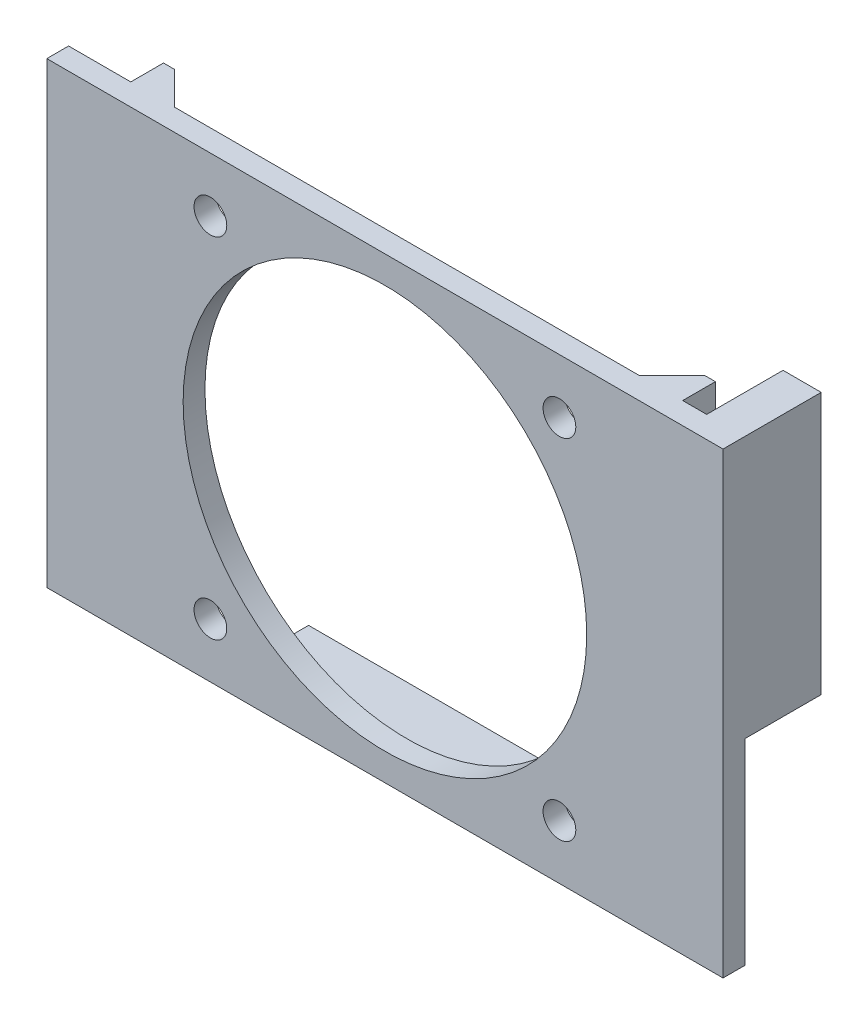
ISO-10303-21;
HEADER;
FILE_DESCRIPTION(('STEP AP214'),'2;1');
FILE_NAME('part.step','',(''),(''),'','','');
FILE_SCHEMA(('AUTOMOTIVE_DESIGN { 1 0 10303 214 1 1 1 1 }'));
ENDSEC;
DATA;
#1=APPLICATION_CONTEXT('core data for automotive mechanical design processes');
#2=APPLICATION_PROTOCOL_DEFINITION('international standard','automotive_design',2000,#1);
#3=PRODUCT_CONTEXT('',#1,'mechanical');
#4=PRODUCT('Part','Part','',(#3));
#5=PRODUCT_RELATED_PRODUCT_CATEGORY('part','',(#4));
#6=PRODUCT_DEFINITION_FORMATION('','',#4);
#7=PRODUCT_DEFINITION_CONTEXT('part definition',#1,'design');
#8=PRODUCT_DEFINITION('design','',#6,#7);
#9=PRODUCT_DEFINITION_SHAPE('','',#8);
#10=(LENGTH_UNIT() NAMED_UNIT(*) SI_UNIT(.MILLI.,.METRE.));
#11=(NAMED_UNIT(*) PLANE_ANGLE_UNIT() SI_UNIT($,.RADIAN.));
#12=(NAMED_UNIT(*) SI_UNIT($,.STERADIAN.) SOLID_ANGLE_UNIT());
#13=UNCERTAINTY_MEASURE_WITH_UNIT(LENGTH_MEASURE(1.E-05),#10,'distance_accuracy_value','');
#14=(GEOMETRIC_REPRESENTATION_CONTEXT(3) GLOBAL_UNCERTAINTY_ASSIGNED_CONTEXT((#13)) GLOBAL_UNIT_ASSIGNED_CONTEXT((#10,
#11,#12)) REPRESENTATION_CONTEXT('',''));
#15=CARTESIAN_POINT('',(0.,0.,0.));
#16=DIRECTION('',(0.,0.,1.));
#17=DIRECTION('',(1.,0.,0.));
#18=AXIS2_PLACEMENT_3D('',#15,#16,#17);
#19=CARTESIAN_POINT('',(0.,0.,0.));
#20=DIRECTION('',(0.,0.,1.));
#21=DIRECTION('',(1.,0.,0.));
#22=AXIS2_PLACEMENT_3D('',#19,#20,#21);
#23=PLANE('',#22);
#24=CARTESIAN_POINT('',(0.,0.,0.));
#25=DIRECTION('',(0.,0.,1.));
#26=DIRECTION('',(1.,0.,0.));
#27=AXIS2_PLACEMENT_3D('',#24,#25,#26);
#28=CIRCLE('',#27,18.5);
#29=CARTESIAN_POINT('',(18.5,0.,0.));
#30=VERTEX_POINT('',#29);
#31=EDGE_CURVE('E333',#30,#30,#28,.T.);
#32=ORIENTED_EDGE('',*,*,#31,.T.);
#33=EDGE_LOOP('',(#32));
#34=FACE_BOUND('',#33,.T.);
#35=CARTESIAN_POINT('',(-16.,-16.,0.));
#36=DIRECTION('',(0.,0.,1.));
#37=DIRECTION('',(1.,0.,0.));
#38=AXIS2_PLACEMENT_3D('',#35,#36,#37);
#39=CIRCLE('',#38,1.5);
#40=CARTESIAN_POINT('',(-14.5,-16.,0.));
#41=VERTEX_POINT('',#40);
#42=EDGE_CURVE('E330',#41,#41,#39,.T.);
#43=ORIENTED_EDGE('',*,*,#42,.T.);
#44=EDGE_LOOP('',(#43));
#45=FACE_BOUND('',#44,.T.);
#46=CARTESIAN_POINT('',(16.,-16.,0.));
#47=DIRECTION('',(0.,0.,1.));
#48=DIRECTION('',(1.,0.,0.));
#49=AXIS2_PLACEMENT_3D('',#46,#47,#48);
#50=CIRCLE('',#49,1.5);
#51=CARTESIAN_POINT('',(17.5,-16.,0.));
#52=VERTEX_POINT('',#51);
#53=EDGE_CURVE('E324',#52,#52,#50,.T.);
#54=ORIENTED_EDGE('',*,*,#53,.T.);
#55=EDGE_LOOP('',(#54));
#56=FACE_BOUND('',#55,.T.);
#57=CARTESIAN_POINT('',(16.,16.,0.));
#58=DIRECTION('',(0.,0.,1.));
#59=DIRECTION('',(1.,0.,0.));
#60=AXIS2_PLACEMENT_3D('',#57,#58,#59);
#61=CIRCLE('',#60,1.5);
#62=CARTESIAN_POINT('',(17.5,16.,0.));
#63=VERTEX_POINT('',#62);
#64=EDGE_CURVE('E318',#63,#63,#61,.T.);
#65=ORIENTED_EDGE('',*,*,#64,.T.);
#66=EDGE_LOOP('',(#65));
#67=FACE_BOUND('',#66,.T.);
#68=CARTESIAN_POINT('',(-16.,16.,0.));
#69=DIRECTION('',(0.,0.,1.));
#70=DIRECTION('',(1.,0.,0.));
#71=AXIS2_PLACEMENT_3D('',#68,#69,#70);
#72=CIRCLE('',#71,1.5);
#73=CARTESIAN_POINT('',(-14.5,16.,0.));
#74=VERTEX_POINT('',#73);
#75=EDGE_CURVE('E312',#74,#74,#72,.T.);
#76=ORIENTED_EDGE('',*,*,#75,.T.);
#77=EDGE_LOOP('',(#76));
#78=FACE_BOUND('',#77,.T.);
#79=DIRECTION('',(0.,-1.,0.));
#80=VECTOR('',#79,1.);
#81=CARTESIAN_POINT('',(-21.3,21.,0.));
#82=LINE('',#81,#80);
#83=CARTESIAN_POINT('',(-21.3,21.,0.));
#84=VERTEX_POINT('',#83);
#85=CARTESIAN_POINT('',(-21.3,-16.,0.));
#86=VERTEX_POINT('',#85);
#87=EDGE_CURVE('E213',#84,#86,#82,.T.);
#88=ORIENTED_EDGE('',*,*,#87,.F.);
#89=DIRECTION('',(-1.,0.,0.));
#90=VECTOR('',#89,1.);
#91=CARTESIAN_POINT('',(-31.,21.,0.));
#92=LINE('',#91,#90);
#93=CARTESIAN_POINT('',(21.3,21.,0.));
#94=VERTEX_POINT('',#93);
#95=EDGE_CURVE('E363',#94,#84,#92,.T.);
#96=ORIENTED_EDGE('',*,*,#95,.F.);
#97=DIRECTION('',(0.,1.,0.));
#98=VECTOR('',#97,1.);
#99=CARTESIAN_POINT('',(21.3,21.,0.));
#100=LINE('',#99,#98);
#101=CARTESIAN_POINT('',(21.3,-16.,0.));
#102=VERTEX_POINT('',#101);
#103=EDGE_CURVE('E223',#102,#94,#100,.T.);
#104=ORIENTED_EDGE('',*,*,#103,.F.);
#105=DIRECTION('',(-1.,0.,0.));
#106=VECTOR('',#105,1.);
#107=CARTESIAN_POINT('',(25.3,-16.,0.));
#108=LINE('',#107,#106);
#109=CARTESIAN_POINT('',(25.3,-16.,0.));
#110=VERTEX_POINT('',#109);
#111=EDGE_CURVE('E230',#110,#102,#108,.T.);
#112=ORIENTED_EDGE('',*,*,#111,.F.);
#113=DIRECTION('',(0.,-1.,0.));
#114=VECTOR('',#113,1.);
#115=CARTESIAN_POINT('',(25.3,21.,0.));
#116=LINE('',#115,#114);
#117=CARTESIAN_POINT('',(25.3,21.,0.));
#118=VERTEX_POINT('',#117);
#119=EDGE_CURVE('E204',#118,#110,#116,.T.);
#120=ORIENTED_EDGE('',*,*,#119,.F.);
#121=CARTESIAN_POINT('',(27.5,21.,0.));
#122=VERTEX_POINT('',#121);
#123=EDGE_CURVE('E344',#122,#118,#92,.T.);
#124=ORIENTED_EDGE('',*,*,#123,.F.);
#125=DIRECTION('',(0.,1.,0.));
#126=VECTOR('',#125,1.);
#127=CARTESIAN_POINT('',(27.5,21.,0.));
#128=LINE('',#127,#126);
#129=CARTESIAN_POINT('',(27.5,-3.00000000000001,0.));
#130=VERTEX_POINT('',#129);
#131=EDGE_CURVE('E289',#130,#122,#128,.T.);
#132=ORIENTED_EDGE('',*,*,#131,.F.);
#133=DIRECTION('',(-1.,0.,0.));
#134=VECTOR('',#133,1.);
#135=CARTESIAN_POINT('',(31.,-3.00000000000001,0.));
#136=LINE('',#135,#134);
#137=CARTESIAN_POINT('',(31.,-3.,0.));
#138=VERTEX_POINT('',#137);
#139=EDGE_CURVE('E284',#138,#130,#136,.T.);
#140=ORIENTED_EDGE('',*,*,#139,.F.);
#141=DIRECTION('',(0.,1.,0.));
#142=VECTOR('',#141,1.);
#143=CARTESIAN_POINT('',(31.,21.,0.));
#144=LINE('',#143,#142);
#145=CARTESIAN_POINT('',(31.,-21.,0.));
#146=VERTEX_POINT('',#145);
#147=EDGE_CURVE('E357',#146,#138,#144,.T.);
#148=ORIENTED_EDGE('',*,*,#147,.F.);
#149=DIRECTION('',(1.,0.,0.));
#150=VECTOR('',#149,1.);
#151=CARTESIAN_POINT('',(-31.,-21.,0.));
#152=LINE('',#151,#150);
#153=CARTESIAN_POINT('',(14.,-21.,0.));
#154=VERTEX_POINT('',#153);
#155=EDGE_CURVE('E353',#154,#146,#152,.T.);
#156=ORIENTED_EDGE('',*,*,#155,.F.);
#157=DIRECTION('',(0.,-1.,0.));
#158=VECTOR('',#157,1.);
#159=CARTESIAN_POINT('',(14.,-19.,0.));
#160=LINE('',#159,#158);
#161=CARTESIAN_POINT('',(14.,-19.,0.));
#162=VERTEX_POINT('',#161);
#163=EDGE_CURVE('E236',#162,#154,#160,.T.);
#164=ORIENTED_EDGE('',*,*,#163,.F.);
#165=DIRECTION('',(1.,0.,0.));
#166=VECTOR('',#165,1.);
#167=CARTESIAN_POINT('',(14.,-19.,0.));
#168=LINE('',#167,#166);
#169=CARTESIAN_POINT('',(-14.,-19.,0.));
#170=VERTEX_POINT('',#169);
#171=EDGE_CURVE('E241',#170,#162,#168,.T.);
#172=ORIENTED_EDGE('',*,*,#171,.F.);
#173=DIRECTION('',(0.,1.,0.));
#174=VECTOR('',#173,1.);
#175=CARTESIAN_POINT('',(-14.,-19.,0.));
#176=LINE('',#175,#174);
#177=CARTESIAN_POINT('',(-14.,-21.,0.));
#178=VERTEX_POINT('',#177);
#179=EDGE_CURVE('E249',#178,#170,#176,.T.);
#180=ORIENTED_EDGE('',*,*,#179,.F.);
#181=CARTESIAN_POINT('',(-27.5,-21.,0.));
#182=VERTEX_POINT('',#181);
#183=EDGE_CURVE('E354',#182,#178,#152,.T.);
#184=ORIENTED_EDGE('',*,*,#183,.F.);
#185=DIRECTION('',(0.,-1.,0.));
#186=VECTOR('',#185,1.);
#187=CARTESIAN_POINT('',(-27.5,4.,0.));
#188=LINE('',#187,#186);
#189=CARTESIAN_POINT('',(-27.5,4.,0.));
#190=VERTEX_POINT('',#189);
#191=EDGE_CURVE('E262',#190,#182,#188,.T.);
#192=ORIENTED_EDGE('',*,*,#191,.F.);
#193=DIRECTION('',(1.,0.,0.));
#194=VECTOR('',#193,1.);
#195=CARTESIAN_POINT('',(-27.5,4.,0.));
#196=LINE('',#195,#194);
#197=CARTESIAN_POINT('',(-31.,4.,0.));
#198=VERTEX_POINT('',#197);
#199=EDGE_CURVE('E267',#198,#190,#196,.T.);
#200=ORIENTED_EDGE('',*,*,#199,.F.);
#201=DIRECTION('',(0.,-1.,0.));
#202=VECTOR('',#201,1.);
#203=CARTESIAN_POINT('',(-31.,21.,0.));
#204=LINE('',#203,#202);
#205=CARTESIAN_POINT('',(-31.,21.,0.));
#206=VERTEX_POINT('',#205);
#207=EDGE_CURVE('E337',#206,#198,#204,.T.);
#208=ORIENTED_EDGE('',*,*,#207,.F.);
#209=CARTESIAN_POINT('',(-25.3,21.,0.));
#210=VERTEX_POINT('',#209);
#211=EDGE_CURVE('E360',#210,#206,#92,.T.);
#212=ORIENTED_EDGE('',*,*,#211,.F.);
#213=DIRECTION('',(0.,1.,0.));
#214=VECTOR('',#213,1.);
#215=CARTESIAN_POINT('',(-25.3,21.,0.));
#216=LINE('',#215,#214);
#217=CARTESIAN_POINT('',(-25.3,-16.,0.));
#218=VERTEX_POINT('',#217);
#219=EDGE_CURVE('E194',#218,#210,#216,.T.);
#220=ORIENTED_EDGE('',*,*,#219,.F.);
#221=DIRECTION('',(-1.,0.,0.));
#222=VECTOR('',#221,1.);
#223=CARTESIAN_POINT('',(-21.3,-16.,0.));
#224=LINE('',#223,#222);
#225=EDGE_CURVE('E200',#86,#218,#224,.T.);
#226=ORIENTED_EDGE('',*,*,#225,.F.);
#227=EDGE_LOOP('',(#88,#96,#104,#112,#120,#124,#132,#140,#148,#156,#164,#172,#180,#184,#192,
#200,#208,#212,#220,#226));
#228=FACE_BOUND('',#227,.T.);
#229=ADVANCED_FACE('F35',(#34,#45,#56,#67,#78,#228),#23,.F.);
#230=CARTESIAN_POINT('',(0.,0.,2.));
#231=DIRECTION('',(0.,0.,1.));
#232=DIRECTION('',(1.,0.,0.));
#233=AXIS2_PLACEMENT_3D('',#230,#231,#232);
#234=PLANE('',#233);
#235=CARTESIAN_POINT('',(-16.,16.,2.));
#236=DIRECTION('',(0.,0.,1.));
#237=DIRECTION('',(1.,0.,0.));
#238=AXIS2_PLACEMENT_3D('',#235,#236,#237);
#239=CIRCLE('',#238,1.5);
#240=CARTESIAN_POINT('',(-14.5,16.,2.));
#241=VERTEX_POINT('',#240);
#242=EDGE_CURVE('E309',#241,#241,#239,.T.);
#243=ORIENTED_EDGE('',*,*,#242,.F.);
#244=EDGE_LOOP('',(#243));
#245=FACE_BOUND('',#244,.T.);
#246=CARTESIAN_POINT('',(16.,16.,2.));
#247=DIRECTION('',(0.,0.,1.));
#248=DIRECTION('',(1.,0.,0.));
#249=AXIS2_PLACEMENT_3D('',#246,#247,#248);
#250=CIRCLE('',#249,1.5);
#251=CARTESIAN_POINT('',(17.5,16.,2.));
#252=VERTEX_POINT('',#251);
#253=EDGE_CURVE('E315',#252,#252,#250,.T.);
#254=ORIENTED_EDGE('',*,*,#253,.F.);
#255=EDGE_LOOP('',(#254));
#256=FACE_BOUND('',#255,.T.);
#257=CARTESIAN_POINT('',(16.,-16.,2.));
#258=DIRECTION('',(0.,0.,1.));
#259=DIRECTION('',(1.,0.,0.));
#260=AXIS2_PLACEMENT_3D('',#257,#258,#259);
#261=CIRCLE('',#260,1.5);
#262=CARTESIAN_POINT('',(17.5,-16.,2.));
#263=VERTEX_POINT('',#262);
#264=EDGE_CURVE('E321',#263,#263,#261,.T.);
#265=ORIENTED_EDGE('',*,*,#264,.F.);
#266=EDGE_LOOP('',(#265));
#267=FACE_BOUND('',#266,.T.);
#268=CARTESIAN_POINT('',(-16.,-16.,2.));
#269=DIRECTION('',(0.,0.,1.));
#270=DIRECTION('',(1.,0.,0.));
#271=AXIS2_PLACEMENT_3D('',#268,#269,#270);
#272=CIRCLE('',#271,1.5);
#273=CARTESIAN_POINT('',(-14.5,-16.,2.));
#274=VERTEX_POINT('',#273);
#275=EDGE_CURVE('E327',#274,#274,#272,.T.);
#276=ORIENTED_EDGE('',*,*,#275,.F.);
#277=EDGE_LOOP('',(#276));
#278=FACE_BOUND('',#277,.T.);
#279=DIRECTION('',(0.,-1.,0.));
#280=VECTOR('',#279,1.);
#281=CARTESIAN_POINT('',(-31.,21.,2.));
#282=LINE('',#281,#280);
#283=CARTESIAN_POINT('',(-31.,21.,2.));
#284=VERTEX_POINT('',#283);
#285=CARTESIAN_POINT('',(-31.,-21.,2.));
#286=VERTEX_POINT('',#285);
#287=EDGE_CURVE('E340',#284,#286,#282,.T.);
#288=ORIENTED_EDGE('',*,*,#287,.T.);
#289=DIRECTION('',(1.,0.,0.));
#290=VECTOR('',#289,1.);
#291=CARTESIAN_POINT('',(-31.,-21.,2.));
#292=LINE('',#291,#290);
#293=CARTESIAN_POINT('',(31.,-21.,2.));
#294=VERTEX_POINT('',#293);
#295=EDGE_CURVE('E343',#286,#294,#292,.T.);
#296=ORIENTED_EDGE('',*,*,#295,.T.);
#297=DIRECTION('',(0.,1.,0.));
#298=VECTOR('',#297,1.);
#299=CARTESIAN_POINT('',(31.,21.,2.));
#300=LINE('',#299,#298);
#301=CARTESIAN_POINT('',(31.,21.,2.));
#302=VERTEX_POINT('',#301);
#303=EDGE_CURVE('E346',#294,#302,#300,.T.);
#304=ORIENTED_EDGE('',*,*,#303,.T.);
#305=DIRECTION('',(-1.,0.,0.));
#306=VECTOR('',#305,1.);
#307=CARTESIAN_POINT('',(-31.,21.,2.));
#308=LINE('',#307,#306);
#309=EDGE_CURVE('E348',#302,#284,#308,.T.);
#310=ORIENTED_EDGE('',*,*,#309,.T.);
#311=EDGE_LOOP('',(#288,#296,#304,#310));
#312=FACE_BOUND('',#311,.T.);
#313=CARTESIAN_POINT('',(0.,0.,2.));
#314=DIRECTION('',(0.,0.,1.));
#315=DIRECTION('',(1.,0.,0.));
#316=AXIS2_PLACEMENT_3D('',#313,#314,#315);
#317=CIRCLE('',#316,18.5);
#318=CARTESIAN_POINT('',(18.5,0.,2.));
#319=VERTEX_POINT('',#318);
#320=EDGE_CURVE('E334',#319,#319,#317,.T.);
#321=ORIENTED_EDGE('',*,*,#320,.F.);
#322=EDGE_LOOP('',(#321));
#323=FACE_BOUND('',#322,.T.);
#324=ADVANCED_FACE('F402',(#245,#256,#267,#278,#312,#323),#234,.T.);
#325=CARTESIAN_POINT('',(-31.,21.,2.));
#326=DIRECTION('',(1.,0.,0.));
#327=DIRECTION('',(0.,1.,0.));
#328=AXIS2_PLACEMENT_3D('',#325,#326,#327);
#329=PLANE('',#328);
#330=ORIENTED_EDGE('',*,*,#207,.T.);
#331=DIRECTION('',(0.,0.,1.));
#332=VECTOR('',#331,1.);
#333=CARTESIAN_POINT('',(-31.,4.,-7.));
#334=LINE('',#333,#332);
#335=CARTESIAN_POINT('',(-31.,4.,-7.));
#336=VERTEX_POINT('',#335);
#337=EDGE_CURVE('E279',#336,#198,#334,.T.);
#338=ORIENTED_EDGE('',*,*,#337,.F.);
#339=DIRECTION('',(0.,1.,0.));
#340=VECTOR('',#339,1.);
#341=CARTESIAN_POINT('',(-31.,4.,-7.));
#342=LINE('',#341,#340);
#343=CARTESIAN_POINT('',(-31.,-21.,-7.));
#344=VERTEX_POINT('',#343);
#345=EDGE_CURVE('E270',#344,#336,#342,.T.);
#346=ORIENTED_EDGE('',*,*,#345,.F.);
#347=DIRECTION('',(0.,0.,-1.));
#348=VECTOR('',#347,1.);
#349=CARTESIAN_POINT('',(-31.,-21.,2.));
#350=LINE('',#349,#348);
#351=EDGE_CURVE('E371',#286,#344,#350,.T.);
#352=ORIENTED_EDGE('',*,*,#351,.F.);
#353=ORIENTED_EDGE('',*,*,#287,.F.);
#354=DIRECTION('',(0.,0.,-1.));
#355=VECTOR('',#354,1.);
#356=CARTESIAN_POINT('',(-31.,21.,2.));
#357=LINE('',#356,#355);
#358=EDGE_CURVE('E350',#284,#206,#357,.T.);
#359=ORIENTED_EDGE('',*,*,#358,.T.);
#360=EDGE_LOOP('',(#330,#338,#346,#352,#353,#359));
#361=FACE_BOUND('',#360,.T.);
#362=ADVANCED_FACE('F408',(#361),#329,.F.);
#363=CARTESIAN_POINT('',(-31.,-21.,2.));
#364=DIRECTION('',(0.,1.,0.));
#365=DIRECTION('',(0.,0.,1.));
#366=AXIS2_PLACEMENT_3D('',#363,#364,#365);
#367=PLANE('',#366);
#368=ORIENTED_EDGE('',*,*,#351,.T.);
#369=DIRECTION('',(-1.,0.,0.));
#370=VECTOR('',#369,1.);
#371=CARTESIAN_POINT('',(-27.5,-21.,-7.));
#372=LINE('',#371,#370);
#373=CARTESIAN_POINT('',(-27.5,-21.,-7.));
#374=VERTEX_POINT('',#373);
#375=EDGE_CURVE('E266',#374,#344,#372,.T.);
#376=ORIENTED_EDGE('',*,*,#375,.F.);
#377=DIRECTION('',(0.,0.,1.));
#378=VECTOR('',#377,1.);
#379=CARTESIAN_POINT('',(-27.5,-21.,-7.));
#380=LINE('',#379,#378);
#381=EDGE_CURVE('E281',#374,#182,#380,.T.);
#382=ORIENTED_EDGE('',*,*,#381,.T.);
#383=ORIENTED_EDGE('',*,*,#183,.T.);
#384=DIRECTION('',(0.,0.,1.));
#385=VECTOR('',#384,1.);
#386=CARTESIAN_POINT('',(-14.,-21.,-5.));
#387=LINE('',#386,#385);
#388=CARTESIAN_POINT('',(-14.,-21.,-5.));
#389=VERTEX_POINT('',#388);
#390=EDGE_CURVE('E257',#389,#178,#387,.T.);
#391=ORIENTED_EDGE('',*,*,#390,.F.);
#392=DIRECTION('',(-1.,0.,0.));
#393=VECTOR('',#392,1.);
#394=CARTESIAN_POINT('',(14.,-21.,-5.));
#395=LINE('',#394,#393);
#396=CARTESIAN_POINT('',(14.,-21.,-5.));
#397=VERTEX_POINT('',#396);
#398=EDGE_CURVE('E240',#397,#389,#395,.T.);
#399=ORIENTED_EDGE('',*,*,#398,.F.);
#400=DIRECTION('',(0.,0.,1.));
#401=VECTOR('',#400,1.);
#402=CARTESIAN_POINT('',(14.,-21.,-5.));
#403=LINE('',#402,#401);
#404=EDGE_CURVE('E259',#397,#154,#403,.T.);
#405=ORIENTED_EDGE('',*,*,#404,.T.);
#406=ORIENTED_EDGE('',*,*,#155,.T.);
#407=DIRECTION('',(0.,0.,-1.));
#408=VECTOR('',#407,1.);
#409=CARTESIAN_POINT('',(31.,-21.,2.));
#410=LINE('',#409,#408);
#411=EDGE_CURVE('E368',#294,#146,#410,.T.);
#412=ORIENTED_EDGE('',*,*,#411,.F.);
#413=ORIENTED_EDGE('',*,*,#295,.F.);
#414=EDGE_LOOP('',(#368,#376,#382,#383,#391,#399,#405,#406,#412,#413));
#415=FACE_BOUND('',#414,.T.);
#416=ADVANCED_FACE('F420',(#415),#367,.F.);
#417=CARTESIAN_POINT('',(31.,21.,2.));
#418=DIRECTION('',(-1.,0.,0.));
#419=DIRECTION('',(0.,-1.,0.));
#420=AXIS2_PLACEMENT_3D('',#417,#418,#419);
#421=PLANE('',#420);
#422=ORIENTED_EDGE('',*,*,#147,.T.);
#423=DIRECTION('',(0.,0.,1.));
#424=VECTOR('',#423,1.);
#425=CARTESIAN_POINT('',(31.,-3.00000000000001,-7.));
#426=LINE('',#425,#424);
#427=CARTESIAN_POINT('',(31.,-3.00000000000001,-7.));
#428=VERTEX_POINT('',#427);
#429=EDGE_CURVE('E306',#428,#138,#426,.T.);
#430=ORIENTED_EDGE('',*,*,#429,.F.);
#431=DIRECTION('',(0.,-1.,0.));
#432=VECTOR('',#431,1.);
#433=CARTESIAN_POINT('',(31.,21.,-7.));
#434=LINE('',#433,#432);
#435=CARTESIAN_POINT('',(31.,21.,-7.));
#436=VERTEX_POINT('',#435);
#437=EDGE_CURVE('E285',#436,#428,#434,.T.);
#438=ORIENTED_EDGE('',*,*,#437,.F.);
#439=DIRECTION('',(0.,0.,-1.));
#440=VECTOR('',#439,1.);
#441=CARTESIAN_POINT('',(31.,21.,2.));
#442=LINE('',#441,#440);
#443=EDGE_CURVE('E366',#302,#436,#442,.T.);
#444=ORIENTED_EDGE('',*,*,#443,.F.);
#445=ORIENTED_EDGE('',*,*,#303,.F.);
#446=ORIENTED_EDGE('',*,*,#411,.T.);
#447=EDGE_LOOP('',(#422,#430,#438,#444,#445,#446));
#448=FACE_BOUND('',#447,.T.);
#449=ADVANCED_FACE('F417',(#448),#421,.F.);
#450=CARTESIAN_POINT('',(-31.,21.,2.));
#451=DIRECTION('',(0.,-1.,0.));
#452=DIRECTION('',(0.,0.,-1.));
#453=AXIS2_PLACEMENT_3D('',#450,#451,#452);
#454=PLANE('',#453);
#455=ORIENTED_EDGE('',*,*,#95,.T.);
#456=DIRECTION('',(-0.707106781186545,0.,-0.70710678118655));
#457=VECTOR('',#456,1.);
#458=CARTESIAN_POINT('',(-24.3,21.,-3.));
#459=LINE('',#458,#457);
#460=CARTESIAN_POINT('',(-24.3,21.,-3.));
#461=VERTEX_POINT('',#460);
#462=EDGE_CURVE('E377',#84,#461,#459,.T.);
#463=ORIENTED_EDGE('',*,*,#462,.T.);
#464=DIRECTION('',(1.,0.,0.));
#465=VECTOR('',#464,1.);
#466=CARTESIAN_POINT('',(-21.3,21.,-3.));
#467=LINE('',#466,#465);
#468=CARTESIAN_POINT('',(-25.3,21.,-3.));
#469=VERTEX_POINT('',#468);
#470=EDGE_CURVE('E209',#469,#461,#467,.T.);
#471=ORIENTED_EDGE('',*,*,#470,.F.);
#472=DIRECTION('',(0.,0.,1.));
#473=VECTOR('',#472,1.);
#474=CARTESIAN_POINT('',(-25.3,21.,-3.));
#475=LINE('',#474,#473);
#476=EDGE_CURVE('E205',#469,#210,#475,.T.);
#477=ORIENTED_EDGE('',*,*,#476,.T.);
#478=ORIENTED_EDGE('',*,*,#211,.T.);
#479=ORIENTED_EDGE('',*,*,#358,.F.);
#480=ORIENTED_EDGE('',*,*,#309,.F.);
#481=ORIENTED_EDGE('',*,*,#443,.T.);
#482=DIRECTION('',(1.,0.,0.));
#483=VECTOR('',#482,1.);
#484=CARTESIAN_POINT('',(31.,21.,-7.));
#485=LINE('',#484,#483);
#486=CARTESIAN_POINT('',(27.5,21.,-7.));
#487=VERTEX_POINT('',#486);
#488=EDGE_CURVE('E293',#487,#436,#485,.T.);
#489=ORIENTED_EDGE('',*,*,#488,.F.);
#490=DIRECTION('',(0.,0.,1.));
#491=VECTOR('',#490,1.);
#492=CARTESIAN_POINT('',(27.5,21.,-7.));
#493=LINE('',#492,#491);
#494=EDGE_CURVE('E296',#487,#122,#493,.T.);
#495=ORIENTED_EDGE('',*,*,#494,.T.);
#496=ORIENTED_EDGE('',*,*,#123,.T.);
#497=DIRECTION('',(0.,0.,1.));
#498=VECTOR('',#497,1.);
#499=CARTESIAN_POINT('',(25.3,21.,-3.));
#500=LINE('',#499,#498);
#501=CARTESIAN_POINT('',(25.3,21.,-3.));
#502=VERTEX_POINT('',#501);
#503=EDGE_CURVE('E227',#502,#118,#500,.T.);
#504=ORIENTED_EDGE('',*,*,#503,.F.);
#505=DIRECTION('',(1.,0.,0.));
#506=VECTOR('',#505,1.);
#507=CARTESIAN_POINT('',(25.3,21.,-3.));
#508=LINE('',#507,#506);
#509=CARTESIAN_POINT('',(24.3,21.,-3.));
#510=VERTEX_POINT('',#509);
#511=EDGE_CURVE('E225',#510,#502,#508,.T.);
#512=ORIENTED_EDGE('',*,*,#511,.F.);
#513=DIRECTION('',(-0.707106781186545,0.,0.70710678118655));
#514=VECTOR('',#513,1.);
#515=CARTESIAN_POINT('',(24.3,21.,-3.));
#516=LINE('',#515,#514);
#517=EDGE_CURVE('E57',#510,#94,#516,.T.);
#518=ORIENTED_EDGE('',*,*,#517,.T.);
#519=EDGE_LOOP('',(#455,#463,#471,#477,#478,#479,#480,#481,#489,#495,#496,#504,#512,#518));
#520=FACE_BOUND('',#519,.T.);
#521=ADVANCED_FACE('F384',(#520),#454,.F.);
#522=CARTESIAN_POINT('',(0.,0.,2.));
#523=DIRECTION('',(0.,0.,-1.));
#524=DIRECTION('',(-1.,0.,0.));
#525=AXIS2_PLACEMENT_3D('',#522,#523,#524);
#526=CYLINDRICAL_SURFACE('',#525,18.5);
#527=ORIENTED_EDGE('',*,*,#320,.T.);
#528=EDGE_LOOP('',(#527));
#529=FACE_BOUND('',#528,.T.);
#530=ORIENTED_EDGE('',*,*,#31,.F.);
#531=EDGE_LOOP('',(#530));
#532=FACE_BOUND('',#531,.T.);
#533=ADVANCED_FACE('F416',(#529,#532),#526,.F.);
#534=CARTESIAN_POINT('',(-16.,-16.,2.));
#535=DIRECTION('',(0.,0.,1.));
#536=DIRECTION('',(1.,0.,0.));
#537=AXIS2_PLACEMENT_3D('',#534,#535,#536);
#538=CYLINDRICAL_SURFACE('',#537,1.5);
#539=ORIENTED_EDGE('',*,*,#42,.F.);
#540=EDGE_LOOP('',(#539));
#541=FACE_BOUND('',#540,.T.);
#542=ORIENTED_EDGE('',*,*,#275,.T.);
#543=EDGE_LOOP('',(#542));
#544=FACE_BOUND('',#543,.T.);
#545=ADVANCED_FACE('F530',(#541,#544),#538,.F.);
#546=CARTESIAN_POINT('',(16.,-16.,2.));
#547=DIRECTION('',(0.,0.,1.));
#548=DIRECTION('',(1.,0.,0.));
#549=AXIS2_PLACEMENT_3D('',#546,#547,#548);
#550=CYLINDRICAL_SURFACE('',#549,1.5);
#551=ORIENTED_EDGE('',*,*,#53,.F.);
#552=EDGE_LOOP('',(#551));
#553=FACE_BOUND('',#552,.T.);
#554=ORIENTED_EDGE('',*,*,#264,.T.);
#555=EDGE_LOOP('',(#554));
#556=FACE_BOUND('',#555,.T.);
#557=ADVANCED_FACE('F526',(#553,#556),#550,.F.);
#558=CARTESIAN_POINT('',(16.,16.,2.));
#559=DIRECTION('',(0.,0.,1.));
#560=DIRECTION('',(1.,0.,0.));
#561=AXIS2_PLACEMENT_3D('',#558,#559,#560);
#562=CYLINDRICAL_SURFACE('',#561,1.5);
#563=ORIENTED_EDGE('',*,*,#64,.F.);
#564=EDGE_LOOP('',(#563));
#565=FACE_BOUND('',#564,.T.);
#566=ORIENTED_EDGE('',*,*,#253,.T.);
#567=EDGE_LOOP('',(#566));
#568=FACE_BOUND('',#567,.T.);
#569=ADVANCED_FACE('F522',(#565,#568),#562,.F.);
#570=CARTESIAN_POINT('',(-16.,16.,2.));
#571=DIRECTION('',(0.,0.,1.));
#572=DIRECTION('',(1.,0.,0.));
#573=AXIS2_PLACEMENT_3D('',#570,#571,#572);
#574=CYLINDRICAL_SURFACE('',#573,1.5);
#575=ORIENTED_EDGE('',*,*,#75,.F.);
#576=EDGE_LOOP('',(#575));
#577=FACE_BOUND('',#576,.T.);
#578=ORIENTED_EDGE('',*,*,#242,.T.);
#579=EDGE_LOOP('',(#578));
#580=FACE_BOUND('',#579,.T.);
#581=ADVANCED_FACE('F519',(#577,#580),#574,.F.);
#582=CARTESIAN_POINT('',(31.,-3.00000000000001,-7.));
#583=DIRECTION('',(0.,1.,0.));
#584=DIRECTION('',(0.,0.,1.));
#585=AXIS2_PLACEMENT_3D('',#582,#583,#584);
#586=PLANE('',#585);
#587=ORIENTED_EDGE('',*,*,#139,.T.);
#588=DIRECTION('',(0.,0.,1.));
#589=VECTOR('',#588,1.);
#590=CARTESIAN_POINT('',(27.5,-3.00000000000001,-7.));
#591=LINE('',#590,#589);
#592=CARTESIAN_POINT('',(27.5,-3.00000000000001,-7.));
#593=VERTEX_POINT('',#592);
#594=EDGE_CURVE('E303',#593,#130,#591,.T.);
#595=ORIENTED_EDGE('',*,*,#594,.F.);
#596=DIRECTION('',(-1.,0.,0.));
#597=VECTOR('',#596,1.);
#598=CARTESIAN_POINT('',(31.,-3.00000000000001,-7.));
#599=LINE('',#598,#597);
#600=EDGE_CURVE('E288',#428,#593,#599,.T.);
#601=ORIENTED_EDGE('',*,*,#600,.F.);
#602=ORIENTED_EDGE('',*,*,#429,.T.);
#603=EDGE_LOOP('',(#587,#595,#601,#602));
#604=FACE_BOUND('',#603,.T.);
#605=ADVANCED_FACE('F470',(#604),#586,.F.);
#606=CARTESIAN_POINT('',(27.5,21.,-7.));
#607=DIRECTION('',(1.,0.,0.));
#608=DIRECTION('',(0.,1.,0.));
#609=AXIS2_PLACEMENT_3D('',#606,#607,#608);
#610=PLANE('',#609);
#611=ORIENTED_EDGE('',*,*,#131,.T.);
#612=ORIENTED_EDGE('',*,*,#494,.F.);
#613=DIRECTION('',(0.,1.,0.));
#614=VECTOR('',#613,1.);
#615=CARTESIAN_POINT('',(27.5,21.,-7.));
#616=LINE('',#615,#614);
#617=EDGE_CURVE('E291',#593,#487,#616,.T.);
#618=ORIENTED_EDGE('',*,*,#617,.F.);
#619=ORIENTED_EDGE('',*,*,#594,.T.);
#620=EDGE_LOOP('',(#611,#612,#618,#619));
#621=FACE_BOUND('',#620,.T.);
#622=ADVANCED_FACE('F473',(#621),#610,.F.);
#623=CARTESIAN_POINT('',(0.,0.,-7.));
#624=DIRECTION('',(0.,0.,-1.));
#625=DIRECTION('',(-1.,0.,0.));
#626=AXIS2_PLACEMENT_3D('',#623,#624,#625);
#627=PLANE('',#626);
#628=ORIENTED_EDGE('',*,*,#437,.T.);
#629=ORIENTED_EDGE('',*,*,#600,.T.);
#630=ORIENTED_EDGE('',*,*,#617,.T.);
#631=ORIENTED_EDGE('',*,*,#488,.T.);
#632=EDGE_LOOP('',(#628,#629,#630,#631));
#633=FACE_BOUND('',#632,.T.);
#634=ADVANCED_FACE('F464',(#633),#627,.T.);
#635=CARTESIAN_POINT('',(-27.5,4.,-7.));
#636=DIRECTION('',(-1.,0.,0.));
#637=DIRECTION('',(0.,-1.,0.));
#638=AXIS2_PLACEMENT_3D('',#635,#636,#637);
#639=PLANE('',#638);
#640=ORIENTED_EDGE('',*,*,#191,.T.);
#641=ORIENTED_EDGE('',*,*,#381,.F.);
#642=DIRECTION('',(0.,-1.,0.));
#643=VECTOR('',#642,1.);
#644=CARTESIAN_POINT('',(-27.5,4.,-7.));
#645=LINE('',#644,#643);
#646=CARTESIAN_POINT('',(-27.5,4.,-7.));
#647=VERTEX_POINT('',#646);
#648=EDGE_CURVE('E263',#647,#374,#645,.T.);
#649=ORIENTED_EDGE('',*,*,#648,.F.);
#650=DIRECTION('',(0.,0.,1.));
#651=VECTOR('',#650,1.);
#652=CARTESIAN_POINT('',(-27.5,4.,-7.));
#653=LINE('',#652,#651);
#654=EDGE_CURVE('E274',#647,#190,#653,.T.);
#655=ORIENTED_EDGE('',*,*,#654,.T.);
#656=EDGE_LOOP('',(#640,#641,#649,#655));
#657=FACE_BOUND('',#656,.T.);
#658=ADVANCED_FACE('F449',(#657),#639,.F.);
#659=CARTESIAN_POINT('',(-27.5,4.,-7.));
#660=DIRECTION('',(0.,-1.,0.));
#661=DIRECTION('',(1.,0.,0.));
#662=AXIS2_PLACEMENT_3D('',#659,#660,#661);
#663=PLANE('',#662);
#664=ORIENTED_EDGE('',*,*,#199,.T.);
#665=ORIENTED_EDGE('',*,*,#654,.F.);
#666=DIRECTION('',(1.,0.,0.));
#667=VECTOR('',#666,1.);
#668=CARTESIAN_POINT('',(-27.5,4.,-7.));
#669=LINE('',#668,#667);
#670=EDGE_CURVE('E272',#336,#647,#669,.T.);
#671=ORIENTED_EDGE('',*,*,#670,.F.);
#672=ORIENTED_EDGE('',*,*,#337,.T.);
#673=EDGE_LOOP('',(#664,#665,#671,#672));
#674=FACE_BOUND('',#673,.T.);
#675=ADVANCED_FACE('F446',(#674),#663,.F.);
#676=CARTESIAN_POINT('',(0.,0.,-7.));
#677=DIRECTION('',(0.,0.,-1.));
#678=DIRECTION('',(-1.,0.,0.));
#679=AXIS2_PLACEMENT_3D('',#676,#677,#678);
#680=PLANE('',#679);
#681=ORIENTED_EDGE('',*,*,#648,.T.);
#682=ORIENTED_EDGE('',*,*,#375,.T.);
#683=ORIENTED_EDGE('',*,*,#345,.T.);
#684=ORIENTED_EDGE('',*,*,#670,.T.);
#685=EDGE_LOOP('',(#681,#682,#683,#684));
#686=FACE_BOUND('',#685,.T.);
#687=ADVANCED_FACE('F452',(#686),#680,.T.);
#688=CARTESIAN_POINT('',(14.,-19.,-5.));
#689=DIRECTION('',(-1.,0.,0.));
#690=DIRECTION('',(0.,0.,1.));
#691=AXIS2_PLACEMENT_3D('',#688,#689,#690);
#692=PLANE('',#691);
#693=ORIENTED_EDGE('',*,*,#163,.T.);
#694=ORIENTED_EDGE('',*,*,#404,.F.);
#695=DIRECTION('',(0.,-1.,0.));
#696=VECTOR('',#695,1.);
#697=CARTESIAN_POINT('',(14.,-19.,-5.));
#698=LINE('',#697,#696);
#699=CARTESIAN_POINT('',(14.,-19.,-5.));
#700=VERTEX_POINT('',#699);
#701=EDGE_CURVE('E237',#700,#397,#698,.T.);
#702=ORIENTED_EDGE('',*,*,#701,.F.);
#703=DIRECTION('',(0.,0.,1.));
#704=VECTOR('',#703,1.);
#705=CARTESIAN_POINT('',(14.,-19.,-5.));
#706=LINE('',#705,#704);
#707=EDGE_CURVE('E247',#700,#162,#706,.T.);
#708=ORIENTED_EDGE('',*,*,#707,.T.);
#709=EDGE_LOOP('',(#693,#694,#702,#708));
#710=FACE_BOUND('',#709,.T.);
#711=ADVANCED_FACE('F481',(#710),#692,.F.);
#712=CARTESIAN_POINT('',(-14.,-19.,-5.));
#713=DIRECTION('',(1.,0.,0.));
#714=DIRECTION('',(0.,0.,-1.));
#715=AXIS2_PLACEMENT_3D('',#712,#713,#714);
#716=PLANE('',#715);
#717=ORIENTED_EDGE('',*,*,#179,.T.);
#718=DIRECTION('',(0.,0.,1.));
#719=VECTOR('',#718,1.);
#720=CARTESIAN_POINT('',(-14.,-19.,-5.));
#721=LINE('',#720,#719);
#722=CARTESIAN_POINT('',(-14.,-19.,-5.));
#723=VERTEX_POINT('',#722);
#724=EDGE_CURVE('E254',#723,#170,#721,.T.);
#725=ORIENTED_EDGE('',*,*,#724,.F.);
#726=DIRECTION('',(0.,1.,0.));
#727=VECTOR('',#726,1.);
#728=CARTESIAN_POINT('',(-14.,-19.,-5.));
#729=LINE('',#728,#727);
#730=EDGE_CURVE('E243',#389,#723,#729,.T.);
#731=ORIENTED_EDGE('',*,*,#730,.F.);
#732=ORIENTED_EDGE('',*,*,#390,.T.);
#733=EDGE_LOOP('',(#717,#725,#731,#732));
#734=FACE_BOUND('',#733,.T.);
#735=ADVANCED_FACE('F490',(#734),#716,.F.);
#736=CARTESIAN_POINT('',(14.,-19.,-5.));
#737=DIRECTION('',(0.,-1.,0.));
#738=DIRECTION('',(1.,0.,0.));
#739=AXIS2_PLACEMENT_3D('',#736,#737,#738);
#740=PLANE('',#739);
#741=ORIENTED_EDGE('',*,*,#171,.T.);
#742=ORIENTED_EDGE('',*,*,#707,.F.);
#743=DIRECTION('',(1.,0.,0.));
#744=VECTOR('',#743,1.);
#745=CARTESIAN_POINT('',(14.,-19.,-5.));
#746=LINE('',#745,#744);
#747=EDGE_CURVE('E245',#723,#700,#746,.T.);
#748=ORIENTED_EDGE('',*,*,#747,.F.);
#749=ORIENTED_EDGE('',*,*,#724,.T.);
#750=EDGE_LOOP('',(#741,#742,#748,#749));
#751=FACE_BOUND('',#750,.T.);
#752=ADVANCED_FACE('F485',(#751),#740,.F.);
#753=CARTESIAN_POINT('',(0.,0.,-5.));
#754=DIRECTION('',(0.,0.,-1.));
#755=DIRECTION('',(-1.,0.,0.));
#756=AXIS2_PLACEMENT_3D('',#753,#754,#755);
#757=PLANE('',#756);
#758=ORIENTED_EDGE('',*,*,#701,.T.);
#759=ORIENTED_EDGE('',*,*,#398,.T.);
#760=ORIENTED_EDGE('',*,*,#730,.T.);
#761=ORIENTED_EDGE('',*,*,#747,.T.);
#762=EDGE_LOOP('',(#758,#759,#760,#761));
#763=FACE_BOUND('',#762,.T.);
#764=ADVANCED_FACE('F492',(#763),#757,.T.);
#765=CARTESIAN_POINT('',(25.3,21.,-3.));
#766=DIRECTION('',(-1.,0.,0.));
#767=DIRECTION('',(0.,-1.,0.));
#768=AXIS2_PLACEMENT_3D('',#765,#766,#767);
#769=PLANE('',#768);
#770=ORIENTED_EDGE('',*,*,#119,.T.);
#771=DIRECTION('',(0.,0.,1.));
#772=VECTOR('',#771,1.);
#773=CARTESIAN_POINT('',(25.3,-16.,-3.));
#774=LINE('',#773,#772);
#775=CARTESIAN_POINT('',(25.3,-16.,-3.));
#776=VERTEX_POINT('',#775);
#777=EDGE_CURVE('E234',#776,#110,#774,.T.);
#778=ORIENTED_EDGE('',*,*,#777,.F.);
#779=DIRECTION('',(0.,-1.,0.));
#780=VECTOR('',#779,1.);
#781=CARTESIAN_POINT('',(25.3,21.,-3.));
#782=LINE('',#781,#780);
#783=EDGE_CURVE('E219',#502,#776,#782,.T.);
#784=ORIENTED_EDGE('',*,*,#783,.F.);
#785=ORIENTED_EDGE('',*,*,#503,.T.);
#786=EDGE_LOOP('',(#770,#778,#784,#785));
#787=FACE_BOUND('',#786,.T.);
#788=ADVANCED_FACE('F390',(#787),#769,.F.);
#789=CARTESIAN_POINT('',(25.3,-16.,-3.));
#790=DIRECTION('',(0.,1.,0.));
#791=DIRECTION('',(-1.,0.,0.));
#792=AXIS2_PLACEMENT_3D('',#789,#790,#791);
#793=PLANE('',#792);
#794=ORIENTED_EDGE('',*,*,#111,.T.);
#795=DIRECTION('',(0.707106781186545,0.,-0.70710678118655));
#796=VECTOR('',#795,1.);
#797=CARTESIAN_POINT('',(24.3,-16.,-3.00000000000001));
#798=LINE('',#797,#796);
#799=CARTESIAN_POINT('',(24.3,-16.,-3.));
#800=VERTEX_POINT('',#799);
#801=EDGE_CURVE('E11',#102,#800,#798,.T.);
#802=ORIENTED_EDGE('',*,*,#801,.T.);
#803=DIRECTION('',(-1.,0.,0.));
#804=VECTOR('',#803,1.);
#805=CARTESIAN_POINT('',(25.3,-16.,-3.));
#806=LINE('',#805,#804);
#807=EDGE_CURVE('E222',#776,#800,#806,.T.);
#808=ORIENTED_EDGE('',*,*,#807,.F.);
#809=ORIENTED_EDGE('',*,*,#777,.T.);
#810=EDGE_LOOP('',(#794,#802,#808,#809));
#811=FACE_BOUND('',#810,.T.);
#812=ADVANCED_FACE('F392',(#811),#793,.F.);
#813=CARTESIAN_POINT('',(0.,0.,-3.));
#814=DIRECTION('',(0.,0.,-1.));
#815=DIRECTION('',(-1.,0.,0.));
#816=AXIS2_PLACEMENT_3D('',#813,#814,#815);
#817=PLANE('',#816);
#818=ORIENTED_EDGE('',*,*,#807,.T.);
#819=DIRECTION('',(0.,1.,0.));
#820=VECTOR('',#819,1.);
#821=CARTESIAN_POINT('',(24.3,21.,-3.));
#822=LINE('',#821,#820);
#823=EDGE_CURVE('E44',#800,#510,#822,.T.);
#824=ORIENTED_EDGE('',*,*,#823,.T.);
#825=ORIENTED_EDGE('',*,*,#511,.T.);
#826=ORIENTED_EDGE('',*,*,#783,.T.);
#827=EDGE_LOOP('',(#818,#824,#825,#826));
#828=FACE_BOUND('',#827,.T.);
#829=ADVANCED_FACE('F380',(#828),#817,.T.);
#830=CARTESIAN_POINT('',(-21.3,-16.,-3.));
#831=DIRECTION('',(0.,1.,0.));
#832=DIRECTION('',(-1.,0.,0.));
#833=AXIS2_PLACEMENT_3D('',#830,#831,#832);
#834=PLANE('',#833);
#835=DIRECTION('',(-1.,0.,0.));
#836=VECTOR('',#835,1.);
#837=CARTESIAN_POINT('',(-21.3,-16.,-3.));
#838=LINE('',#837,#836);
#839=CARTESIAN_POINT('',(-24.3,-16.,-3.));
#840=VERTEX_POINT('',#839);
#841=CARTESIAN_POINT('',(-25.3,-16.,-3.));
#842=VERTEX_POINT('',#841);
#843=EDGE_CURVE('E184',#840,#842,#838,.T.);
#844=ORIENTED_EDGE('',*,*,#843,.F.);
#845=DIRECTION('',(0.707106781186545,0.,0.70710678118655));
#846=VECTOR('',#845,1.);
#847=CARTESIAN_POINT('',(-24.3,-16.,-3.00000000000001));
#848=LINE('',#847,#846);
#849=EDGE_CURVE('E374',#840,#86,#848,.T.);
#850=ORIENTED_EDGE('',*,*,#849,.T.);
#851=ORIENTED_EDGE('',*,*,#225,.T.);
#852=DIRECTION('',(0.,0.,1.));
#853=VECTOR('',#852,1.);
#854=CARTESIAN_POINT('',(-25.3,-16.,-3.));
#855=LINE('',#854,#853);
#856=EDGE_CURVE('E197',#842,#218,#855,.T.);
#857=ORIENTED_EDGE('',*,*,#856,.F.);
#858=EDGE_LOOP('',(#844,#850,#851,#857));
#859=FACE_BOUND('',#858,.T.);
#860=ADVANCED_FACE('F198',(#859),#834,.F.);
#861=CARTESIAN_POINT('',(-25.3,21.,-3.));
#862=DIRECTION('',(1.,0.,0.));
#863=DIRECTION('',(0.,1.,0.));
#864=AXIS2_PLACEMENT_3D('',#861,#862,#863);
#865=PLANE('',#864);
#866=ORIENTED_EDGE('',*,*,#219,.T.);
#867=ORIENTED_EDGE('',*,*,#476,.F.);
#868=DIRECTION('',(0.,1.,0.));
#869=VECTOR('',#868,1.);
#870=CARTESIAN_POINT('',(-25.3,21.,-3.));
#871=LINE('',#870,#869);
#872=EDGE_CURVE('E189',#842,#469,#871,.T.);
#873=ORIENTED_EDGE('',*,*,#872,.F.);
#874=ORIENTED_EDGE('',*,*,#856,.T.);
#875=EDGE_LOOP('',(#866,#867,#873,#874));
#876=FACE_BOUND('',#875,.T.);
#877=ADVANCED_FACE('F207',(#876),#865,.F.);
#878=CARTESIAN_POINT('',(0.,0.,-3.));
#879=DIRECTION('',(0.,0.,-1.));
#880=DIRECTION('',(-1.,0.,0.));
#881=AXIS2_PLACEMENT_3D('',#878,#879,#880);
#882=PLANE('',#881);
#883=ORIENTED_EDGE('',*,*,#470,.T.);
#884=DIRECTION('',(0.,-1.,0.));
#885=VECTOR('',#884,1.);
#886=CARTESIAN_POINT('',(-24.3,-16.,-3.));
#887=LINE('',#886,#885);
#888=EDGE_CURVE('E192',#461,#840,#887,.T.);
#889=ORIENTED_EDGE('',*,*,#888,.T.);
#890=ORIENTED_EDGE('',*,*,#843,.T.);
#891=ORIENTED_EDGE('',*,*,#872,.T.);
#892=EDGE_LOOP('',(#883,#889,#890,#891));
#893=FACE_BOUND('',#892,.T.);
#894=ADVANCED_FACE('F187',(#893),#882,.T.);
#895=CARTESIAN_POINT('',(-24.3,0.,-3.));
#896=DIRECTION('',(0.70710678118655,0.,-0.707106781186545));
#897=DIRECTION('',(0.,1.,0.));
#898=AXIS2_PLACEMENT_3D('',#895,#896,#897);
#899=PLANE('',#898);
#900=ORIENTED_EDGE('',*,*,#462,.F.);
#901=ORIENTED_EDGE('',*,*,#87,.T.);
#902=ORIENTED_EDGE('',*,*,#849,.F.);
#903=ORIENTED_EDGE('',*,*,#888,.F.);
#904=EDGE_LOOP('',(#900,#901,#902,#903));
#905=FACE_BOUND('',#904,.T.);
#906=ADVANCED_FACE('F396',(#905),#899,.T.);
#907=CARTESIAN_POINT('',(24.3,0.,-3.));
#908=DIRECTION('',(-0.70710678118655,0.,-0.707106781186545));
#909=DIRECTION('',(0.,-1.,0.));
#910=AXIS2_PLACEMENT_3D('',#907,#908,#909);
#911=PLANE('',#910);
#912=ORIENTED_EDGE('',*,*,#801,.F.);
#913=ORIENTED_EDGE('',*,*,#103,.T.);
#914=ORIENTED_EDGE('',*,*,#517,.F.);
#915=ORIENTED_EDGE('',*,*,#823,.F.);
#916=EDGE_LOOP('',(#912,#913,#914,#915));
#917=FACE_BOUND('',#916,.T.);
#918=ADVANCED_FACE('F38',(#917),#911,.T.);
#919=CLOSED_SHELL('',(#229,#324,#362,#416,#449,#521,#533,#545,#557,#569,#581,#605,#622,#634,
#658,#675,#687,#711,#735,#752,#764,#788,#812,#829,#860,#877,#894,#906,#918));
#920=MANIFOLD_SOLID_BREP('B2',#919);
#921=ADVANCED_BREP_SHAPE_REPRESENTATION('',(#18,#920),#14);
#922=SHAPE_DEFINITION_REPRESENTATION(#9,#921);
ENDSEC;
END-ISO-10303-21;
